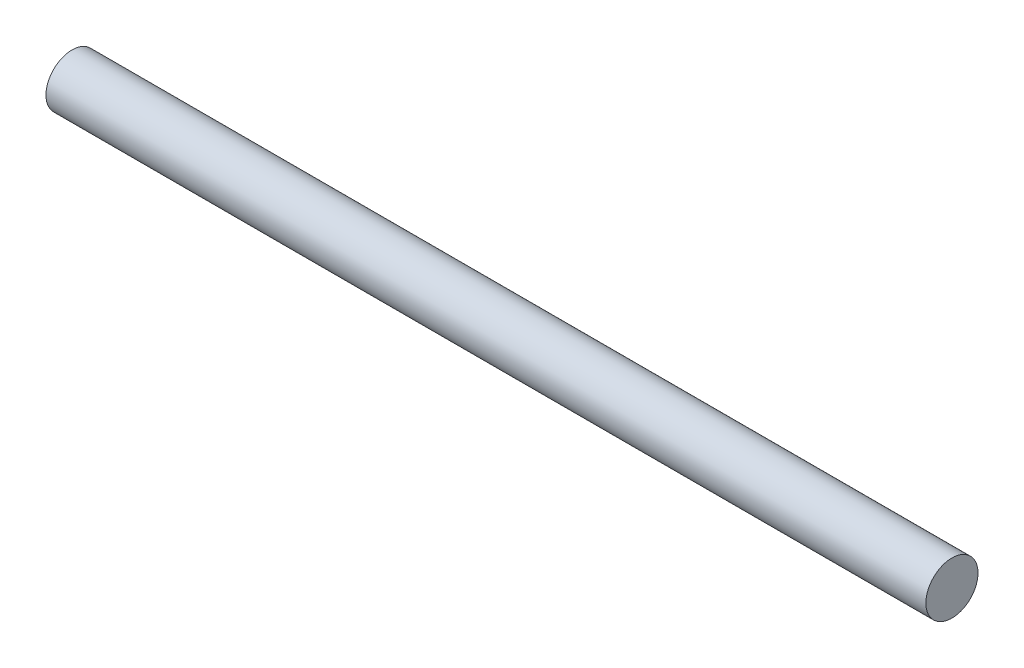
ISO-10303-21;
HEADER;
FILE_DESCRIPTION(('STEP AP214'),'2;1');
FILE_NAME('part.step','',(''),(''),'','','');
FILE_SCHEMA(('AUTOMOTIVE_DESIGN { 1 0 10303 214 1 1 1 1 }'));
ENDSEC;
DATA;
#1=APPLICATION_CONTEXT('core data for automotive mechanical design processes');
#2=APPLICATION_PROTOCOL_DEFINITION('international standard','automotive_design',2000,#1);
#3=PRODUCT_CONTEXT('',#1,'mechanical');
#4=PRODUCT('Part','Part','',(#3));
#5=PRODUCT_RELATED_PRODUCT_CATEGORY('part','',(#4));
#6=PRODUCT_DEFINITION_FORMATION('','',#4);
#7=PRODUCT_DEFINITION_CONTEXT('part definition',#1,'design');
#8=PRODUCT_DEFINITION('design','',#6,#7);
#9=PRODUCT_DEFINITION_SHAPE('','',#8);
#10=(LENGTH_UNIT() NAMED_UNIT(*) SI_UNIT(.MILLI.,.METRE.));
#11=(NAMED_UNIT(*) PLANE_ANGLE_UNIT() SI_UNIT($,.RADIAN.));
#12=(NAMED_UNIT(*) SI_UNIT($,.STERADIAN.) SOLID_ANGLE_UNIT());
#13=UNCERTAINTY_MEASURE_WITH_UNIT(LENGTH_MEASURE(1.E-05),#10,'distance_accuracy_value','');
#14=(GEOMETRIC_REPRESENTATION_CONTEXT(3) GLOBAL_UNCERTAINTY_ASSIGNED_CONTEXT((#13)) GLOBAL_UNIT_ASSIGNED_CONTEXT((#10,
#11,#12)) REPRESENTATION_CONTEXT('',''));
#15=CARTESIAN_POINT('',(0.,0.,0.));
#16=DIRECTION('',(0.,0.,1.));
#17=DIRECTION('',(1.,0.,0.));
#18=AXIS2_PLACEMENT_3D('',#15,#16,#17);
#19=CARTESIAN_POINT('',(120.,0.,0.));
#20=DIRECTION('',(-1.,0.,0.));
#21=DIRECTION('',(0.,0.,1.));
#22=AXIS2_PLACEMENT_3D('',#19,#20,#21);
#23=CYLINDRICAL_SURFACE('',#22,4.);
#24=CARTESIAN_POINT('',(0.,0.,0.));
#25=DIRECTION('',(1.,0.,0.));
#26=DIRECTION('',(0.,0.,-1.));
#27=AXIS2_PLACEMENT_3D('',#24,#25,#26);
#28=CIRCLE('',#27,4.);
#29=CARTESIAN_POINT('',(0.,0.,-4.));
#30=VERTEX_POINT('',#29);
#31=EDGE_CURVE('E10',#30,#30,#28,.T.);
#32=ORIENTED_EDGE('',*,*,#31,.T.);
#33=EDGE_LOOP('',(#32));
#34=FACE_BOUND('',#33,.T.);
#35=CARTESIAN_POINT('',(135.,0.,0.));
#36=DIRECTION('',(1.,0.,0.));
#37=DIRECTION('',(0.,0.,-1.));
#38=AXIS2_PLACEMENT_3D('',#35,#36,#37);
#39=CIRCLE('',#38,4.);
#40=CARTESIAN_POINT('',(135.,0.,-4.));
#41=VERTEX_POINT('',#40);
#42=EDGE_CURVE('E39',#41,#41,#39,.T.);
#43=ORIENTED_EDGE('',*,*,#42,.F.);
#44=EDGE_LOOP('',(#43));
#45=FACE_BOUND('',#44,.T.);
#46=ADVANCED_FACE('F33',(#34,#45),#23,.T.);
#47=CARTESIAN_POINT('',(0.,0.,0.));
#48=DIRECTION('',(1.,0.,0.));
#49=DIRECTION('',(0.,0.,-1.));
#50=AXIS2_PLACEMENT_3D('',#47,#48,#49);
#51=PLANE('',#50);
#52=ORIENTED_EDGE('',*,*,#31,.F.);
#53=EDGE_LOOP('',(#52));
#54=FACE_BOUND('',#53,.T.);
#55=ADVANCED_FACE('F48',(#54),#51,.F.);
#56=CARTESIAN_POINT('',(135.,0.,0.));
#57=DIRECTION('',(1.,0.,0.));
#58=DIRECTION('',(0.,0.,-1.));
#59=AXIS2_PLACEMENT_3D('',#56,#57,#58);
#60=PLANE('',#59);
#61=ORIENTED_EDGE('',*,*,#42,.T.);
#62=EDGE_LOOP('',(#61));
#63=FACE_BOUND('',#62,.T.);
#64=ADVANCED_FACE('F45',(#63),#60,.T.);
#65=CLOSED_SHELL('',(#46,#55,#64));
#66=MANIFOLD_SOLID_BREP('B2',#65);
#67=ADVANCED_BREP_SHAPE_REPRESENTATION('',(#18,#66),#14);
#68=SHAPE_DEFINITION_REPRESENTATION(#9,#67);
ENDSEC;
END-ISO-10303-21;
